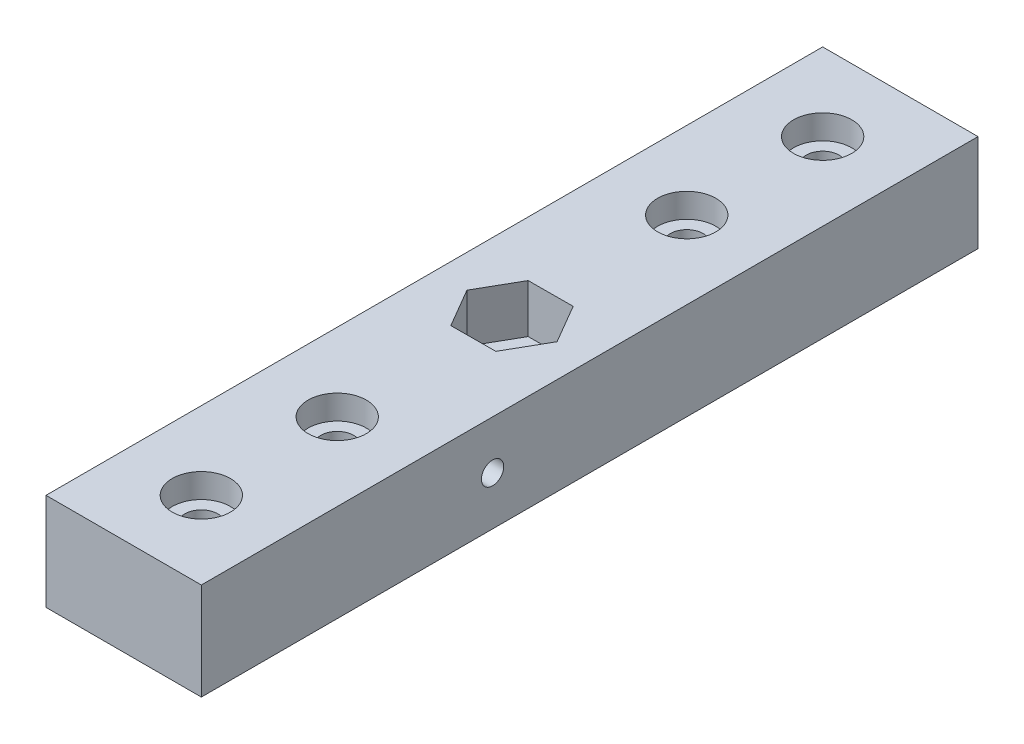
ISO-10303-21;
HEADER;
FILE_DESCRIPTION(('STEP AP214'),'2;1');
FILE_NAME('part.step','',(''),(''),'','','');
FILE_SCHEMA(('AUTOMOTIVE_DESIGN { 1 0 10303 214 1 1 1 1 }'));
ENDSEC;
DATA;
#1=APPLICATION_CONTEXT('core data for automotive mechanical design processes');
#2=APPLICATION_PROTOCOL_DEFINITION('international standard','automotive_design',2000,#1);
#3=PRODUCT_CONTEXT('',#1,'mechanical');
#4=PRODUCT('Part','Part','',(#3));
#5=PRODUCT_RELATED_PRODUCT_CATEGORY('part','',(#4));
#6=PRODUCT_DEFINITION_FORMATION('','',#4);
#7=PRODUCT_DEFINITION_CONTEXT('part definition',#1,'design');
#8=PRODUCT_DEFINITION('design','',#6,#7);
#9=PRODUCT_DEFINITION_SHAPE('','',#8);
#10=(LENGTH_UNIT() NAMED_UNIT(*) SI_UNIT(.MILLI.,.METRE.));
#11=(NAMED_UNIT(*) PLANE_ANGLE_UNIT() SI_UNIT($,.RADIAN.));
#12=(NAMED_UNIT(*) SI_UNIT($,.STERADIAN.) SOLID_ANGLE_UNIT());
#13=UNCERTAINTY_MEASURE_WITH_UNIT(LENGTH_MEASURE(1.E-05),#10,'distance_accuracy_value','');
#14=(GEOMETRIC_REPRESENTATION_CONTEXT(3) GLOBAL_UNCERTAINTY_ASSIGNED_CONTEXT((#13)) GLOBAL_UNIT_ASSIGNED_CONTEXT((#10,
#11,#12)) REPRESENTATION_CONTEXT('',''));
#15=CARTESIAN_POINT('',(0.,0.,0.));
#16=DIRECTION('',(0.,0.,1.));
#17=DIRECTION('',(1.,0.,0.));
#18=AXIS2_PLACEMENT_3D('',#15,#16,#17);
#19=CARTESIAN_POINT('',(0.,10.,0.));
#20=DIRECTION('',(0.,1.,0.));
#21=DIRECTION('',(0.,0.,1.));
#22=AXIS2_PLACEMENT_3D('',#19,#20,#21);
#23=PLANE('',#22);
#24=CARTESIAN_POINT('',(0.,10.,-58.));
#25=DIRECTION('',(0.,1.,0.));
#26=DIRECTION('',(0.,0.,1.));
#27=AXIS2_PLACEMENT_3D('',#24,#25,#26);
#28=CIRCLE('',#27,3.);
#29=CARTESIAN_POINT('',(0.,10.,-55.));
#30=VERTEX_POINT('',#29);
#31=EDGE_CURVE('E159',#30,#30,#28,.T.);
#32=ORIENTED_EDGE('',*,*,#31,.F.);
#33=EDGE_LOOP('',(#32));
#34=FACE_BOUND('',#33,.T.);
#35=CARTESIAN_POINT('',(0.,10.,-22.));
#36=DIRECTION('',(0.,1.,0.));
#37=DIRECTION('',(0.,0.,1.));
#38=AXIS2_PLACEMENT_3D('',#35,#36,#37);
#39=CIRCLE('',#38,3.);
#40=CARTESIAN_POINT('',(0.,10.,-19.));
#41=VERTEX_POINT('',#40);
#42=EDGE_CURVE('E165',#41,#41,#39,.T.);
#43=ORIENTED_EDGE('',*,*,#42,.F.);
#44=EDGE_LOOP('',(#43));
#45=FACE_BOUND('',#44,.T.);
#46=CARTESIAN_POINT('',(0.,10.,-8.));
#47=DIRECTION('',(0.,1.,0.));
#48=DIRECTION('',(0.,0.,1.));
#49=AXIS2_PLACEMENT_3D('',#46,#47,#48);
#50=CIRCLE('',#49,3.);
#51=CARTESIAN_POINT('',(0.,10.,-5.));
#52=VERTEX_POINT('',#51);
#53=EDGE_CURVE('E153',#52,#52,#50,.T.);
#54=ORIENTED_EDGE('',*,*,#53,.F.);
#55=EDGE_LOOP('',(#54));
#56=FACE_BOUND('',#55,.T.);
#57=CARTESIAN_POINT('',(0.,10.,-72.));
#58=DIRECTION('',(0.,1.,0.));
#59=DIRECTION('',(0.,0.,1.));
#60=AXIS2_PLACEMENT_3D('',#57,#58,#59);
#61=CIRCLE('',#60,3.);
#62=CARTESIAN_POINT('',(0.,10.,-69.));
#63=VERTEX_POINT('',#62);
#64=EDGE_CURVE('E173',#63,#63,#61,.T.);
#65=ORIENTED_EDGE('',*,*,#64,.F.);
#66=EDGE_LOOP('',(#65));
#67=FACE_BOUND('',#66,.T.);
#68=DIRECTION('',(0.,0.,1.));
#69=VECTOR('',#68,1.);
#70=CARTESIAN_POINT('',(-8.00000000000001,10.,-80.));
#71=LINE('',#70,#69);
#72=CARTESIAN_POINT('',(-8.00000000000001,10.,-80.));
#73=VERTEX_POINT('',#72);
#74=CARTESIAN_POINT('',(-8.,10.,0.));
#75=VERTEX_POINT('',#74);
#76=EDGE_CURVE('E207',#73,#75,#71,.T.);
#77=ORIENTED_EDGE('',*,*,#76,.T.);
#78=DIRECTION('',(1.,0.,0.));
#79=VECTOR('',#78,1.);
#80=CARTESIAN_POINT('',(-8.,10.,0.));
#81=LINE('',#80,#79);
#82=CARTESIAN_POINT('',(8.,10.,0.));
#83=VERTEX_POINT('',#82);
#84=EDGE_CURVE('E87',#75,#83,#81,.T.);
#85=ORIENTED_EDGE('',*,*,#84,.T.);
#86=DIRECTION('',(0.,0.,-1.));
#87=VECTOR('',#86,1.);
#88=CARTESIAN_POINT('',(7.99999999999999,10.,-80.));
#89=LINE('',#88,#87);
#90=CARTESIAN_POINT('',(7.99999999999999,10.,-80.));
#91=VERTEX_POINT('',#90);
#92=EDGE_CURVE('E210',#83,#91,#89,.T.);
#93=ORIENTED_EDGE('',*,*,#92,.T.);
#94=DIRECTION('',(-1.,0.,0.));
#95=VECTOR('',#94,1.);
#96=CARTESIAN_POINT('',(-8.00000000000001,10.,-80.));
#97=LINE('',#96,#95);
#98=EDGE_CURVE('E59',#91,#73,#97,.T.);
#99=ORIENTED_EDGE('',*,*,#98,.T.);
#100=EDGE_LOOP('',(#77,#85,#93,#99));
#101=FACE_BOUND('',#100,.T.);
#102=DIRECTION('',(0.496138938356846,0.,-0.868243142124452));
#103=VECTOR('',#102,1.);
#104=CARTESIAN_POINT('',(-4.61875636696095,10.,-39.979434106117));
#105=LINE('',#104,#103);
#106=CARTESIAN_POINT('',(-4.61875636696095,10.,-39.979434106117));
#107=VERTEX_POINT('',#106);
#108=CARTESIAN_POINT('',(-2.3271887700347,10.,-43.9896774007378));
#109=VERTEX_POINT('',#108);
#110=EDGE_CURVE('E137',#107,#109,#105,.T.);
#111=ORIENTED_EDGE('',*,*,#110,.T.);
#112=DIRECTION('',(0.999990086919821,0.,-0.00445264663855527));
#113=VECTOR('',#112,1.);
#114=CARTESIAN_POINT('',(-2.3271887700347,10.,-43.9896774007378));
#115=LINE('',#114,#113);
#116=CARTESIAN_POINT('',(2.29156759692625,10.,-44.0102432946208));
#117=VERTEX_POINT('',#116);
#118=EDGE_CURVE('E50',#109,#117,#115,.T.);
#119=ORIENTED_EDGE('',*,*,#118,.T.);
#120=DIRECTION('',(0.503851148562974,0.,0.863790495485897));
#121=VECTOR('',#120,1.);
#122=CARTESIAN_POINT('',(2.29156759692625,10.,-44.0102432946208));
#123=LINE('',#122,#121);
#124=CARTESIAN_POINT('',(4.61875636696093,10.,-40.020565893883));
#125=VERTEX_POINT('',#124);
#126=EDGE_CURVE('E141',#117,#125,#123,.T.);
#127=ORIENTED_EDGE('',*,*,#126,.T.);
#128=DIRECTION('',(-0.496138938356847,0.,0.868243142124452));
#129=VECTOR('',#128,1.);
#130=CARTESIAN_POINT('',(4.61875636696093,10.,-40.020565893883));
#131=LINE('',#130,#129);
#132=CARTESIAN_POINT('',(2.32718877003467,10.,-36.0103225992622));
#133=VERTEX_POINT('',#132);
#134=EDGE_CURVE('E333',#125,#133,#131,.T.);
#135=ORIENTED_EDGE('',*,*,#134,.T.);
#136=DIRECTION('',(-0.999990086919821,0.,0.00445264663855529));
#137=VECTOR('',#136,1.);
#138=CARTESIAN_POINT('',(2.32718877003467,10.,-36.0103225992622));
#139=LINE('',#138,#137);
#140=CARTESIAN_POINT('',(-2.29156759692626,10.,-35.9897567053792));
#141=VERTEX_POINT('',#140);
#142=EDGE_CURVE('E318',#133,#141,#139,.T.);
#143=ORIENTED_EDGE('',*,*,#142,.T.);
#144=DIRECTION('',(-0.503851148562975,0.,-0.863790495485897));
#145=VECTOR('',#144,1.);
#146=CARTESIAN_POINT('',(-2.29156759692626,10.,-35.9897567053792));
#147=LINE('',#146,#145);
#148=EDGE_CURVE('E314',#141,#107,#147,.T.);
#149=ORIENTED_EDGE('',*,*,#148,.T.);
#150=EDGE_LOOP('',(#111,#119,#127,#135,#143,#149));
#151=FACE_BOUND('',#150,.T.);
#152=ADVANCED_FACE('F33',(#34,#45,#56,#67,#101,#151),#23,.T.);
#153=CARTESIAN_POINT('',(0.,10.,-58.));
#154=DIRECTION('',(0.,-1.,0.));
#155=DIRECTION('',(0.,0.,-1.));
#156=AXIS2_PLACEMENT_3D('',#153,#154,#155);
#157=CYLINDRICAL_SURFACE('',#156,1.7);
#158=CARTESIAN_POINT('',(0.,2.5,-58.));
#159=DIRECTION('',(0.,1.,0.));
#160=DIRECTION('',(0.,0.,1.));
#161=AXIS2_PLACEMENT_3D('',#158,#159,#160);
#162=CIRCLE('',#161,1.7);
#163=CARTESIAN_POINT('',(0.,2.5,-56.3));
#164=VERTEX_POINT('',#163);
#165=EDGE_CURVE('E229',#164,#164,#162,.F.);
#166=ORIENTED_EDGE('',*,*,#165,.T.);
#167=EDGE_LOOP('',(#166));
#168=FACE_BOUND('',#167,.T.);
#169=CARTESIAN_POINT('',(0.,7.5,-58.));
#170=DIRECTION('',(0.,1.,0.));
#171=DIRECTION('',(0.,0.,1.));
#172=AXIS2_PLACEMENT_3D('',#169,#170,#171);
#173=CIRCLE('',#172,1.7);
#174=CARTESIAN_POINT('',(0.,7.5,-56.3));
#175=VERTEX_POINT('',#174);
#176=EDGE_CURVE('E180',#175,#175,#173,.T.);
#177=ORIENTED_EDGE('',*,*,#176,.T.);
#178=EDGE_LOOP('',(#177));
#179=FACE_BOUND('',#178,.T.);
#180=ADVANCED_FACE('F246',(#168,#179),#157,.F.);
#181=CARTESIAN_POINT('',(0.,10.,-22.));
#182=DIRECTION('',(0.,-1.,0.));
#183=DIRECTION('',(0.,0.,-1.));
#184=AXIS2_PLACEMENT_3D('',#181,#182,#183);
#185=CYLINDRICAL_SURFACE('',#184,1.7);
#186=CARTESIAN_POINT('',(0.,2.5,-22.));
#187=DIRECTION('',(0.,1.,0.));
#188=DIRECTION('',(0.,0.,1.));
#189=AXIS2_PLACEMENT_3D('',#186,#187,#188);
#190=CIRCLE('',#189,1.7);
#191=CARTESIAN_POINT('',(0.,2.5,-20.3));
#192=VERTEX_POINT('',#191);
#193=EDGE_CURVE('E232',#192,#192,#190,.F.);
#194=ORIENTED_EDGE('',*,*,#193,.T.);
#195=EDGE_LOOP('',(#194));
#196=FACE_BOUND('',#195,.T.);
#197=CARTESIAN_POINT('',(0.,7.5,-22.));
#198=DIRECTION('',(0.,1.,0.));
#199=DIRECTION('',(0.,0.,1.));
#200=AXIS2_PLACEMENT_3D('',#197,#198,#199);
#201=CIRCLE('',#200,1.7);
#202=CARTESIAN_POINT('',(0.,7.5,-20.3));
#203=VERTEX_POINT('',#202);
#204=EDGE_CURVE('E241',#203,#203,#201,.T.);
#205=ORIENTED_EDGE('',*,*,#204,.T.);
#206=EDGE_LOOP('',(#205));
#207=FACE_BOUND('',#206,.T.);
#208=ADVANCED_FACE('F273',(#196,#207),#185,.F.);
#209=CARTESIAN_POINT('',(0.,10.,-8.));
#210=DIRECTION('',(0.,-1.,0.));
#211=DIRECTION('',(0.,0.,-1.));
#212=AXIS2_PLACEMENT_3D('',#209,#210,#211);
#213=CYLINDRICAL_SURFACE('',#212,1.7);
#214=CARTESIAN_POINT('',(0.,2.5,-8.));
#215=DIRECTION('',(0.,1.,0.));
#216=DIRECTION('',(0.,0.,1.));
#217=AXIS2_PLACEMENT_3D('',#214,#215,#216);
#218=CIRCLE('',#217,1.7);
#219=CARTESIAN_POINT('',(0.,2.5,-6.3));
#220=VERTEX_POINT('',#219);
#221=EDGE_CURVE('E228',#220,#220,#218,.F.);
#222=ORIENTED_EDGE('',*,*,#221,.T.);
#223=EDGE_LOOP('',(#222));
#224=FACE_BOUND('',#223,.T.);
#225=CARTESIAN_POINT('',(0.,7.5,-8.));
#226=DIRECTION('',(0.,1.,0.));
#227=DIRECTION('',(0.,0.,1.));
#228=AXIS2_PLACEMENT_3D('',#225,#226,#227);
#229=CIRCLE('',#228,1.7);
#230=CARTESIAN_POINT('',(0.,7.5,-6.3));
#231=VERTEX_POINT('',#230);
#232=EDGE_CURVE('E158',#231,#231,#229,.T.);
#233=ORIENTED_EDGE('',*,*,#232,.T.);
#234=EDGE_LOOP('',(#233));
#235=FACE_BOUND('',#234,.T.);
#236=ADVANCED_FACE('F571',(#224,#235),#213,.F.);
#237=CARTESIAN_POINT('',(0.,10.,-72.));
#238=DIRECTION('',(0.,-1.,0.));
#239=DIRECTION('',(0.,0.,-1.));
#240=AXIS2_PLACEMENT_3D('',#237,#238,#239);
#241=CYLINDRICAL_SURFACE('',#240,1.70000000000001);
#242=CARTESIAN_POINT('',(0.,2.5,-72.));
#243=DIRECTION('',(0.,1.,0.));
#244=DIRECTION('',(0.,0.,1.));
#245=AXIS2_PLACEMENT_3D('',#242,#243,#244);
#246=CIRCLE('',#245,1.70000000000001);
#247=CARTESIAN_POINT('',(0.,2.5,-70.3));
#248=VERTEX_POINT('',#247);
#249=EDGE_CURVE('E200',#248,#248,#246,.F.);
#250=ORIENTED_EDGE('',*,*,#249,.T.);
#251=EDGE_LOOP('',(#250));
#252=FACE_BOUND('',#251,.T.);
#253=CARTESIAN_POINT('',(0.,7.5,-72.));
#254=DIRECTION('',(0.,1.,0.));
#255=DIRECTION('',(0.,0.,1.));
#256=AXIS2_PLACEMENT_3D('',#253,#254,#255);
#257=CIRCLE('',#256,1.70000000000001);
#258=CARTESIAN_POINT('',(0.,7.5,-70.3));
#259=VERTEX_POINT('',#258);
#260=EDGE_CURVE('E176',#259,#259,#257,.T.);
#261=ORIENTED_EDGE('',*,*,#260,.T.);
#262=EDGE_LOOP('',(#261));
#263=FACE_BOUND('',#262,.T.);
#264=ADVANCED_FACE('F297',(#252,#263),#241,.F.);
#265=CARTESIAN_POINT('',(-8.00000000000001,10.,-80.));
#266=DIRECTION('',(1.,0.,0.));
#267=DIRECTION('',(0.,0.,-1.));
#268=AXIS2_PLACEMENT_3D('',#265,#266,#267);
#269=PLANE('',#268);
#270=CARTESIAN_POINT('',(-8.00000000000001,5.,-30.));
#271=DIRECTION('',(1.,0.,0.));
#272=DIRECTION('',(0.,0.,-1.));
#273=AXIS2_PLACEMENT_3D('',#270,#271,#272);
#274=CIRCLE('',#273,1.15);
#275=CARTESIAN_POINT('',(-8.00000000000001,5.,-31.15));
#276=VERTEX_POINT('',#275);
#277=EDGE_CURVE('E146',#276,#276,#274,.T.);
#278=ORIENTED_EDGE('',*,*,#277,.T.);
#279=EDGE_LOOP('',(#278));
#280=FACE_BOUND('',#279,.T.);
#281=DIRECTION('',(0.,0.,1.));
#282=VECTOR('',#281,1.);
#283=CARTESIAN_POINT('',(-8.00000000000001,0.,-80.));
#284=LINE('',#283,#282);
#285=CARTESIAN_POINT('',(-8.00000000000001,0.,-80.));
#286=VERTEX_POINT('',#285);
#287=CARTESIAN_POINT('',(-8.,0.,0.));
#288=VERTEX_POINT('',#287);
#289=EDGE_CURVE('E204',#286,#288,#284,.T.);
#290=ORIENTED_EDGE('',*,*,#289,.T.);
#291=DIRECTION('',(0.,-1.,0.));
#292=VECTOR('',#291,1.);
#293=CARTESIAN_POINT('',(-8.,10.,0.));
#294=LINE('',#293,#292);
#295=EDGE_CURVE('E11',#75,#288,#294,.T.);
#296=ORIENTED_EDGE('',*,*,#295,.F.);
#297=ORIENTED_EDGE('',*,*,#76,.F.);
#298=DIRECTION('',(0.,-1.,0.));
#299=VECTOR('',#298,1.);
#300=CARTESIAN_POINT('',(-8.00000000000001,10.,-80.));
#301=LINE('',#300,#299);
#302=EDGE_CURVE('E213',#73,#286,#301,.T.);
#303=ORIENTED_EDGE('',*,*,#302,.T.);
#304=EDGE_LOOP('',(#290,#296,#297,#303));
#305=FACE_BOUND('',#304,.T.);
#306=ADVANCED_FACE('F35',(#280,#305),#269,.F.);
#307=CARTESIAN_POINT('',(-8.,10.,0.));
#308=DIRECTION('',(0.,0.,-1.));
#309=DIRECTION('',(-1.,0.,0.));
#310=AXIS2_PLACEMENT_3D('',#307,#308,#309);
#311=PLANE('',#310);
#312=DIRECTION('',(1.,0.,0.));
#313=VECTOR('',#312,1.);
#314=CARTESIAN_POINT('',(-8.,0.,0.));
#315=LINE('',#314,#313);
#316=CARTESIAN_POINT('',(8.,0.,0.));
#317=VERTEX_POINT('',#316);
#318=EDGE_CURVE('E216',#288,#317,#315,.T.);
#319=ORIENTED_EDGE('',*,*,#318,.T.);
#320=DIRECTION('',(0.,-1.,0.));
#321=VECTOR('',#320,1.);
#322=CARTESIAN_POINT('',(8.,10.,0.));
#323=LINE('',#322,#321);
#324=EDGE_CURVE('E42',#83,#317,#323,.T.);
#325=ORIENTED_EDGE('',*,*,#324,.F.);
#326=ORIENTED_EDGE('',*,*,#84,.F.);
#327=ORIENTED_EDGE('',*,*,#295,.T.);
#328=EDGE_LOOP('',(#319,#325,#326,#327));
#329=FACE_BOUND('',#328,.T.);
#330=ADVANCED_FACE('F291',(#329),#311,.F.);
#331=CARTESIAN_POINT('',(7.99999999999999,10.,-80.));
#332=DIRECTION('',(-1.,0.,0.));
#333=DIRECTION('',(0.,0.,1.));
#334=AXIS2_PLACEMENT_3D('',#331,#332,#333);
#335=PLANE('',#334);
#336=CARTESIAN_POINT('',(8.,5.,-30.));
#337=DIRECTION('',(1.,0.,0.));
#338=DIRECTION('',(0.,0.,-1.));
#339=AXIS2_PLACEMENT_3D('',#336,#337,#338);
#340=CIRCLE('',#339,1.15);
#341=CARTESIAN_POINT('',(8.,5.,-31.15));
#342=VERTEX_POINT('',#341);
#343=EDGE_CURVE('E142',#342,#342,#340,.T.);
#344=ORIENTED_EDGE('',*,*,#343,.F.);
#345=EDGE_LOOP('',(#344));
#346=FACE_BOUND('',#345,.T.);
#347=DIRECTION('',(0.,0.,-1.));
#348=VECTOR('',#347,1.);
#349=CARTESIAN_POINT('',(7.99999999999999,0.,-80.));
#350=LINE('',#349,#348);
#351=CARTESIAN_POINT('',(7.99999999999999,0.,-80.));
#352=VERTEX_POINT('',#351);
#353=EDGE_CURVE('E218',#317,#352,#350,.T.);
#354=ORIENTED_EDGE('',*,*,#353,.T.);
#355=DIRECTION('',(0.,-1.,0.));
#356=VECTOR('',#355,1.);
#357=CARTESIAN_POINT('',(7.99999999999999,10.,-80.));
#358=LINE('',#357,#356);
#359=EDGE_CURVE('E222',#91,#352,#358,.T.);
#360=ORIENTED_EDGE('',*,*,#359,.F.);
#361=ORIENTED_EDGE('',*,*,#92,.F.);
#362=ORIENTED_EDGE('',*,*,#324,.T.);
#363=EDGE_LOOP('',(#354,#360,#361,#362));
#364=FACE_BOUND('',#363,.T.);
#365=ADVANCED_FACE('F289',(#346,#364),#335,.F.);
#366=CARTESIAN_POINT('',(-8.00000000000001,10.,-80.));
#367=DIRECTION('',(0.,0.,1.));
#368=DIRECTION('',(1.,0.,0.));
#369=AXIS2_PLACEMENT_3D('',#366,#367,#368);
#370=PLANE('',#369);
#371=DIRECTION('',(-1.,0.,0.));
#372=VECTOR('',#371,1.);
#373=CARTESIAN_POINT('',(-8.00000000000001,0.,-80.));
#374=LINE('',#373,#372);
#375=EDGE_CURVE('E80',#352,#286,#374,.T.);
#376=ORIENTED_EDGE('',*,*,#375,.T.);
#377=ORIENTED_EDGE('',*,*,#302,.F.);
#378=ORIENTED_EDGE('',*,*,#98,.F.);
#379=ORIENTED_EDGE('',*,*,#359,.T.);
#380=EDGE_LOOP('',(#376,#377,#378,#379));
#381=FACE_BOUND('',#380,.T.);
#382=ADVANCED_FACE('F285',(#381),#370,.F.);
#383=CARTESIAN_POINT('',(0.,0.,0.));
#384=DIRECTION('',(0.,1.,0.));
#385=DIRECTION('',(0.,0.,1.));
#386=AXIS2_PLACEMENT_3D('',#383,#384,#385);
#387=PLANE('',#386);
#388=CARTESIAN_POINT('',(0.,0.,-40.));
#389=DIRECTION('',(0.,1.,0.));
#390=DIRECTION('',(0.,0.,1.));
#391=AXIS2_PLACEMENT_3D('',#388,#389,#390);
#392=CIRCLE('',#391,2.5);
#393=CARTESIAN_POINT('',(0.,0.,-37.5));
#394=VERTEX_POINT('',#393);
#395=EDGE_CURVE('E341',#394,#394,#392,.F.);
#396=ORIENTED_EDGE('',*,*,#395,.F.);
#397=EDGE_LOOP('',(#396));
#398=FACE_BOUND('',#397,.T.);
#399=CARTESIAN_POINT('',(0.,0.,-58.));
#400=DIRECTION('',(0.,1.,0.));
#401=DIRECTION('',(0.,0.,1.));
#402=AXIS2_PLACEMENT_3D('',#399,#400,#401);
#403=CIRCLE('',#402,2.35);
#404=CARTESIAN_POINT('',(0.,0.,-55.65));
#405=VERTEX_POINT('',#404);
#406=EDGE_CURVE('E181',#405,#405,#403,.T.);
#407=ORIENTED_EDGE('',*,*,#406,.T.);
#408=EDGE_LOOP('',(#407));
#409=FACE_BOUND('',#408,.T.);
#410=CARTESIAN_POINT('',(0.,0.,-22.));
#411=DIRECTION('',(0.,1.,0.));
#412=DIRECTION('',(0.,0.,1.));
#413=AXIS2_PLACEMENT_3D('',#410,#411,#412);
#414=CIRCLE('',#413,2.35);
#415=CARTESIAN_POINT('',(0.,0.,-19.65));
#416=VERTEX_POINT('',#415);
#417=EDGE_CURVE('E188',#416,#416,#414,.T.);
#418=ORIENTED_EDGE('',*,*,#417,.T.);
#419=EDGE_LOOP('',(#418));
#420=FACE_BOUND('',#419,.T.);
#421=CARTESIAN_POINT('',(0.,0.,-8.));
#422=DIRECTION('',(0.,1.,0.));
#423=DIRECTION('',(0.,0.,1.));
#424=AXIS2_PLACEMENT_3D('',#421,#422,#423);
#425=CIRCLE('',#424,2.35);
#426=CARTESIAN_POINT('',(0.,0.,-5.65));
#427=VERTEX_POINT('',#426);
#428=EDGE_CURVE('E194',#427,#427,#425,.T.);
#429=ORIENTED_EDGE('',*,*,#428,.T.);
#430=EDGE_LOOP('',(#429));
#431=FACE_BOUND('',#430,.T.);
#432=CARTESIAN_POINT('',(0.,0.,-72.));
#433=DIRECTION('',(0.,1.,0.));
#434=DIRECTION('',(0.,0.,1.));
#435=AXIS2_PLACEMENT_3D('',#432,#433,#434);
#436=CIRCLE('',#435,2.35000000000001);
#437=CARTESIAN_POINT('',(0.,0.,-69.65));
#438=VERTEX_POINT('',#437);
#439=EDGE_CURVE('E184',#438,#438,#436,.T.);
#440=ORIENTED_EDGE('',*,*,#439,.T.);
#441=EDGE_LOOP('',(#440));
#442=FACE_BOUND('',#441,.T.);
#443=ORIENTED_EDGE('',*,*,#289,.F.);
#444=ORIENTED_EDGE('',*,*,#375,.F.);
#445=ORIENTED_EDGE('',*,*,#353,.F.);
#446=ORIENTED_EDGE('',*,*,#318,.F.);
#447=EDGE_LOOP('',(#443,#444,#445,#446));
#448=FACE_BOUND('',#447,.T.);
#449=ADVANCED_FACE('F282',(#398,#409,#420,#431,#442,#448),#387,.F.);
#450=CARTESIAN_POINT('',(0.,2.5,-72.));
#451=DIRECTION('',(0.,-1.,0.));
#452=DIRECTION('',(0.,0.,-1.));
#453=AXIS2_PLACEMENT_3D('',#450,#451,#452);
#454=CYLINDRICAL_SURFACE('',#453,2.35000000000001);
#455=CARTESIAN_POINT('',(0.,2.5,-72.));
#456=DIRECTION('',(0.,1.,0.));
#457=DIRECTION('',(0.,0.,1.));
#458=AXIS2_PLACEMENT_3D('',#455,#456,#457);
#459=CIRCLE('',#458,2.35000000000001);
#460=CARTESIAN_POINT('',(0.,2.5,-69.65));
#461=VERTEX_POINT('',#460);
#462=EDGE_CURVE('E201',#461,#461,#459,.T.);
#463=ORIENTED_EDGE('',*,*,#462,.T.);
#464=EDGE_LOOP('',(#463));
#465=FACE_BOUND('',#464,.T.);
#466=ORIENTED_EDGE('',*,*,#439,.F.);
#467=EDGE_LOOP('',(#466));
#468=FACE_BOUND('',#467,.T.);
#469=ADVANCED_FACE('F280',(#465,#468),#454,.F.);
#470=CARTESIAN_POINT('',(0.,2.5,-72.));
#471=DIRECTION('',(0.,1.,0.));
#472=DIRECTION('',(0.,0.,1.));
#473=AXIS2_PLACEMENT_3D('',#470,#471,#472);
#474=PLANE('',#473);
#475=ORIENTED_EDGE('',*,*,#249,.F.);
#476=EDGE_LOOP('',(#475));
#477=FACE_BOUND('',#476,.T.);
#478=ORIENTED_EDGE('',*,*,#462,.F.);
#479=EDGE_LOOP('',(#478));
#480=FACE_BOUND('',#479,.T.);
#481=ADVANCED_FACE('F439',(#477,#480),#474,.F.);
#482=CARTESIAN_POINT('',(0.,2.5,-8.));
#483=DIRECTION('',(0.,-1.,0.));
#484=DIRECTION('',(0.,0.,-1.));
#485=AXIS2_PLACEMENT_3D('',#482,#483,#484);
#486=CYLINDRICAL_SURFACE('',#485,2.35);
#487=CARTESIAN_POINT('',(0.,2.5,-8.));
#488=DIRECTION('',(0.,1.,0.));
#489=DIRECTION('',(0.,0.,1.));
#490=AXIS2_PLACEMENT_3D('',#487,#488,#489);
#491=CIRCLE('',#490,2.35);
#492=CARTESIAN_POINT('',(0.,2.5,-5.65));
#493=VERTEX_POINT('',#492);
#494=EDGE_CURVE('E197',#493,#493,#491,.T.);
#495=ORIENTED_EDGE('',*,*,#494,.T.);
#496=EDGE_LOOP('',(#495));
#497=FACE_BOUND('',#496,.T.);
#498=ORIENTED_EDGE('',*,*,#428,.F.);
#499=EDGE_LOOP('',(#498));
#500=FACE_BOUND('',#499,.T.);
#501=ADVANCED_FACE('F446',(#497,#500),#486,.F.);
#502=CARTESIAN_POINT('',(0.,2.5,-8.));
#503=DIRECTION('',(0.,1.,0.));
#504=DIRECTION('',(0.,0.,1.));
#505=AXIS2_PLACEMENT_3D('',#502,#503,#504);
#506=PLANE('',#505);
#507=ORIENTED_EDGE('',*,*,#221,.F.);
#508=EDGE_LOOP('',(#507));
#509=FACE_BOUND('',#508,.T.);
#510=ORIENTED_EDGE('',*,*,#494,.F.);
#511=EDGE_LOOP('',(#510));
#512=FACE_BOUND('',#511,.T.);
#513=ADVANCED_FACE('F454',(#509,#512),#506,.F.);
#514=CARTESIAN_POINT('',(0.,2.5,-22.));
#515=DIRECTION('',(0.,-1.,0.));
#516=DIRECTION('',(0.,0.,-1.));
#517=AXIS2_PLACEMENT_3D('',#514,#515,#516);
#518=CYLINDRICAL_SURFACE('',#517,2.35);
#519=CARTESIAN_POINT('',(0.,2.5,-22.));
#520=DIRECTION('',(0.,1.,0.));
#521=DIRECTION('',(0.,0.,1.));
#522=AXIS2_PLACEMENT_3D('',#519,#520,#521);
#523=CIRCLE('',#522,2.35);
#524=CARTESIAN_POINT('',(0.,2.5,-19.65));
#525=VERTEX_POINT('',#524);
#526=EDGE_CURVE('E191',#525,#525,#523,.T.);
#527=ORIENTED_EDGE('',*,*,#526,.T.);
#528=EDGE_LOOP('',(#527));
#529=FACE_BOUND('',#528,.T.);
#530=ORIENTED_EDGE('',*,*,#417,.F.);
#531=EDGE_LOOP('',(#530));
#532=FACE_BOUND('',#531,.T.);
#533=ADVANCED_FACE('F462',(#529,#532),#518,.F.);
#534=CARTESIAN_POINT('',(0.,2.5,-22.));
#535=DIRECTION('',(0.,1.,0.));
#536=DIRECTION('',(0.,0.,1.));
#537=AXIS2_PLACEMENT_3D('',#534,#535,#536);
#538=PLANE('',#537);
#539=ORIENTED_EDGE('',*,*,#193,.F.);
#540=EDGE_LOOP('',(#539));
#541=FACE_BOUND('',#540,.T.);
#542=ORIENTED_EDGE('',*,*,#526,.F.);
#543=EDGE_LOOP('',(#542));
#544=FACE_BOUND('',#543,.T.);
#545=ADVANCED_FACE('F470',(#541,#544),#538,.F.);
#546=CARTESIAN_POINT('',(0.,2.5,-58.));
#547=DIRECTION('',(0.,-1.,0.));
#548=DIRECTION('',(0.,0.,-1.));
#549=AXIS2_PLACEMENT_3D('',#546,#547,#548);
#550=CYLINDRICAL_SURFACE('',#549,2.35);
#551=CARTESIAN_POINT('',(0.,2.5,-58.));
#552=DIRECTION('',(0.,1.,0.));
#553=DIRECTION('',(0.,0.,1.));
#554=AXIS2_PLACEMENT_3D('',#551,#552,#553);
#555=CIRCLE('',#554,2.35);
#556=CARTESIAN_POINT('',(0.,2.5,-55.65));
#557=VERTEX_POINT('',#556);
#558=EDGE_CURVE('E185',#557,#557,#555,.T.);
#559=ORIENTED_EDGE('',*,*,#558,.T.);
#560=EDGE_LOOP('',(#559));
#561=FACE_BOUND('',#560,.T.);
#562=ORIENTED_EDGE('',*,*,#406,.F.);
#563=EDGE_LOOP('',(#562));
#564=FACE_BOUND('',#563,.T.);
#565=ADVANCED_FACE('F477',(#561,#564),#550,.F.);
#566=CARTESIAN_POINT('',(0.,2.5,-58.));
#567=DIRECTION('',(0.,1.,0.));
#568=DIRECTION('',(0.,0.,1.));
#569=AXIS2_PLACEMENT_3D('',#566,#567,#568);
#570=PLANE('',#569);
#571=ORIENTED_EDGE('',*,*,#165,.F.);
#572=EDGE_LOOP('',(#571));
#573=FACE_BOUND('',#572,.T.);
#574=ORIENTED_EDGE('',*,*,#558,.F.);
#575=EDGE_LOOP('',(#574));
#576=FACE_BOUND('',#575,.T.);
#577=ADVANCED_FACE('F485',(#573,#576),#570,.F.);
#578=CARTESIAN_POINT('',(0.,10.,-72.));
#579=DIRECTION('',(0.,-1.,0.));
#580=DIRECTION('',(0.,0.,-1.));
#581=AXIS2_PLACEMENT_3D('',#578,#579,#580);
#582=CYLINDRICAL_SURFACE('',#581,3.);
#583=ORIENTED_EDGE('',*,*,#64,.T.);
#584=EDGE_LOOP('',(#583));
#585=FACE_BOUND('',#584,.T.);
#586=CARTESIAN_POINT('',(0.,7.5,-72.));
#587=DIRECTION('',(0.,1.,0.));
#588=DIRECTION('',(0.,0.,1.));
#589=AXIS2_PLACEMENT_3D('',#586,#587,#588);
#590=CIRCLE('',#589,3.);
#591=CARTESIAN_POINT('',(0.,7.5,-69.));
#592=VERTEX_POINT('',#591);
#593=EDGE_CURVE('E177',#592,#592,#590,.T.);
#594=ORIENTED_EDGE('',*,*,#593,.F.);
#595=EDGE_LOOP('',(#594));
#596=FACE_BOUND('',#595,.T.);
#597=ADVANCED_FACE('F492',(#585,#596),#582,.F.);
#598=CARTESIAN_POINT('',(0.,7.5,-72.));
#599=DIRECTION('',(0.,1.,0.));
#600=DIRECTION('',(0.,0.,1.));
#601=AXIS2_PLACEMENT_3D('',#598,#599,#600);
#602=PLANE('',#601);
#603=ORIENTED_EDGE('',*,*,#260,.F.);
#604=EDGE_LOOP('',(#603));
#605=FACE_BOUND('',#604,.T.);
#606=ORIENTED_EDGE('',*,*,#593,.T.);
#607=EDGE_LOOP('',(#606));
#608=FACE_BOUND('',#607,.T.);
#609=ADVANCED_FACE('F501',(#605,#608),#602,.T.);
#610=CARTESIAN_POINT('',(0.,10.,-8.));
#611=DIRECTION('',(0.,-1.,0.));
#612=DIRECTION('',(0.,0.,-1.));
#613=AXIS2_PLACEMENT_3D('',#610,#611,#612);
#614=CYLINDRICAL_SURFACE('',#613,3.);
#615=ORIENTED_EDGE('',*,*,#53,.T.);
#616=EDGE_LOOP('',(#615));
#617=FACE_BOUND('',#616,.T.);
#618=CARTESIAN_POINT('',(0.,7.5,-8.));
#619=DIRECTION('',(0.,1.,0.));
#620=DIRECTION('',(0.,0.,1.));
#621=AXIS2_PLACEMENT_3D('',#618,#619,#620);
#622=CIRCLE('',#621,3.);
#623=CARTESIAN_POINT('',(0.,7.5,-5.));
#624=VERTEX_POINT('',#623);
#625=EDGE_CURVE('E168',#624,#624,#622,.T.);
#626=ORIENTED_EDGE('',*,*,#625,.F.);
#627=EDGE_LOOP('',(#626));
#628=FACE_BOUND('',#627,.T.);
#629=ADVANCED_FACE('F510',(#617,#628),#614,.F.);
#630=CARTESIAN_POINT('',(0.,7.5,-8.));
#631=DIRECTION('',(0.,1.,0.));
#632=DIRECTION('',(0.,0.,1.));
#633=AXIS2_PLACEMENT_3D('',#630,#631,#632);
#634=PLANE('',#633);
#635=ORIENTED_EDGE('',*,*,#232,.F.);
#636=EDGE_LOOP('',(#635));
#637=FACE_BOUND('',#636,.T.);
#638=ORIENTED_EDGE('',*,*,#625,.T.);
#639=EDGE_LOOP('',(#638));
#640=FACE_BOUND('',#639,.T.);
#641=ADVANCED_FACE('F518',(#637,#640),#634,.T.);
#642=CARTESIAN_POINT('',(0.,10.,-22.));
#643=DIRECTION('',(0.,-1.,0.));
#644=DIRECTION('',(0.,0.,-1.));
#645=AXIS2_PLACEMENT_3D('',#642,#643,#644);
#646=CYLINDRICAL_SURFACE('',#645,3.);
#647=ORIENTED_EDGE('',*,*,#42,.T.);
#648=EDGE_LOOP('',(#647));
#649=FACE_BOUND('',#648,.T.);
#650=CARTESIAN_POINT('',(0.,7.5,-22.));
#651=DIRECTION('',(0.,1.,0.));
#652=DIRECTION('',(0.,0.,1.));
#653=AXIS2_PLACEMENT_3D('',#650,#651,#652);
#654=CIRCLE('',#653,3.);
#655=CARTESIAN_POINT('',(0.,7.5,-19.));
#656=VERTEX_POINT('',#655);
#657=EDGE_CURVE('E162',#656,#656,#654,.T.);
#658=ORIENTED_EDGE('',*,*,#657,.F.);
#659=EDGE_LOOP('',(#658));
#660=FACE_BOUND('',#659,.T.);
#661=ADVANCED_FACE('F263',(#649,#660),#646,.F.);
#662=CARTESIAN_POINT('',(0.,7.5,-22.));
#663=DIRECTION('',(0.,1.,0.));
#664=DIRECTION('',(0.,0.,1.));
#665=AXIS2_PLACEMENT_3D('',#662,#663,#664);
#666=PLANE('',#665);
#667=ORIENTED_EDGE('',*,*,#204,.F.);
#668=EDGE_LOOP('',(#667));
#669=FACE_BOUND('',#668,.T.);
#670=ORIENTED_EDGE('',*,*,#657,.T.);
#671=EDGE_LOOP('',(#670));
#672=FACE_BOUND('',#671,.T.);
#673=ADVANCED_FACE('F257',(#669,#672),#666,.T.);
#674=CARTESIAN_POINT('',(0.,10.,-58.));
#675=DIRECTION('',(0.,-1.,0.));
#676=DIRECTION('',(0.,0.,-1.));
#677=AXIS2_PLACEMENT_3D('',#674,#675,#676);
#678=CYLINDRICAL_SURFACE('',#677,3.);
#679=ORIENTED_EDGE('',*,*,#31,.T.);
#680=EDGE_LOOP('',(#679));
#681=FACE_BOUND('',#680,.T.);
#682=CARTESIAN_POINT('',(0.,7.5,-58.));
#683=DIRECTION('',(0.,1.,0.));
#684=DIRECTION('',(0.,0.,1.));
#685=AXIS2_PLACEMENT_3D('',#682,#683,#684);
#686=CIRCLE('',#685,3.);
#687=CARTESIAN_POINT('',(0.,7.5,-55.));
#688=VERTEX_POINT('',#687);
#689=EDGE_CURVE('E155',#688,#688,#686,.T.);
#690=ORIENTED_EDGE('',*,*,#689,.F.);
#691=EDGE_LOOP('',(#690));
#692=FACE_BOUND('',#691,.T.);
#693=ADVANCED_FACE('F252',(#681,#692),#678,.F.);
#694=CARTESIAN_POINT('',(0.,7.5,-58.));
#695=DIRECTION('',(0.,1.,0.));
#696=DIRECTION('',(0.,0.,1.));
#697=AXIS2_PLACEMENT_3D('',#694,#695,#696);
#698=PLANE('',#697);
#699=ORIENTED_EDGE('',*,*,#176,.F.);
#700=EDGE_LOOP('',(#699));
#701=FACE_BOUND('',#700,.T.);
#702=ORIENTED_EDGE('',*,*,#689,.T.);
#703=EDGE_LOOP('',(#702));
#704=FACE_BOUND('',#703,.T.);
#705=ADVANCED_FACE('F248',(#701,#704),#698,.T.);
#706=CARTESIAN_POINT('',(-8.00000000000001,5.,-30.));
#707=DIRECTION('',(1.,0.,0.));
#708=DIRECTION('',(0.,0.,-1.));
#709=AXIS2_PLACEMENT_3D('',#706,#707,#708);
#710=CYLINDRICAL_SURFACE('',#709,1.15);
#711=ORIENTED_EDGE('',*,*,#277,.F.);
#712=EDGE_LOOP('',(#711));
#713=FACE_BOUND('',#712,.T.);
#714=ORIENTED_EDGE('',*,*,#343,.T.);
#715=EDGE_LOOP('',(#714));
#716=FACE_BOUND('',#715,.T.);
#717=ADVANCED_FACE('F251',(#713,#716),#710,.F.);
#718=CARTESIAN_POINT('',(-2.3271887700347,5.,-43.9896774007378));
#719=DIRECTION('',(0.00445264663855527,0.,0.999990086919821));
#720=DIRECTION('',(0.999990086919822,0.,-0.00445264663855528));
#721=AXIS2_PLACEMENT_3D('',#718,#719,#720);
#722=PLANE('',#721);
#723=ORIENTED_EDGE('',*,*,#118,.F.);
#724=DIRECTION('',(0.,1.,0.));
#725=VECTOR('',#724,1.);
#726=CARTESIAN_POINT('',(-2.3271887700347,5.,-43.9896774007378));
#727=LINE('',#726,#725);
#728=CARTESIAN_POINT('',(-2.3271887700347,5.,-43.9896774007378));
#729=VERTEX_POINT('',#728);
#730=EDGE_CURVE('E136',#729,#109,#727,.T.);
#731=ORIENTED_EDGE('',*,*,#730,.F.);
#732=DIRECTION('',(0.999990086919821,0.,-0.00445264663855527));
#733=VECTOR('',#732,1.);
#734=CARTESIAN_POINT('',(-2.3271887700347,5.,-43.9896774007378));
#735=LINE('',#734,#733);
#736=CARTESIAN_POINT('',(2.29156759692625,5.,-44.0102432946208));
#737=VERTEX_POINT('',#736);
#738=EDGE_CURVE('E127',#729,#737,#735,.T.);
#739=ORIENTED_EDGE('',*,*,#738,.T.);
#740=DIRECTION('',(0.,1.,0.));
#741=VECTOR('',#740,1.);
#742=CARTESIAN_POINT('',(2.29156759692625,5.,-44.0102432946208));
#743=LINE('',#742,#741);
#744=EDGE_CURVE('E135',#737,#117,#743,.T.);
#745=ORIENTED_EDGE('',*,*,#744,.T.);
#746=EDGE_LOOP('',(#723,#731,#739,#745));
#747=FACE_BOUND('',#746,.T.);
#748=ADVANCED_FACE('F134',(#747),#722,.T.);
#749=CARTESIAN_POINT('',(2.29156759692625,5.,-44.0102432946208));
#750=DIRECTION('',(-0.863790495485897,0.,0.503851148562974));
#751=DIRECTION('',(0.503851148562974,0.,0.863790495485897));
#752=AXIS2_PLACEMENT_3D('',#749,#750,#751);
#753=PLANE('',#752);
#754=ORIENTED_EDGE('',*,*,#126,.F.);
#755=ORIENTED_EDGE('',*,*,#744,.F.);
#756=DIRECTION('',(0.503851148562974,0.,0.863790495485897));
#757=VECTOR('',#756,1.);
#758=CARTESIAN_POINT('',(2.29156759692625,5.,-44.0102432946208));
#759=LINE('',#758,#757);
#760=CARTESIAN_POINT('',(4.61875636696093,5.,-40.020565893883));
#761=VERTEX_POINT('',#760);
#762=EDGE_CURVE('E123',#737,#761,#759,.T.);
#763=ORIENTED_EDGE('',*,*,#762,.T.);
#764=DIRECTION('',(0.,1.,0.));
#765=VECTOR('',#764,1.);
#766=CARTESIAN_POINT('',(4.61875636696093,5.,-40.020565893883));
#767=LINE('',#766,#765);
#768=EDGE_CURVE('E143',#761,#125,#767,.T.);
#769=ORIENTED_EDGE('',*,*,#768,.T.);
#770=EDGE_LOOP('',(#754,#755,#763,#769));
#771=FACE_BOUND('',#770,.T.);
#772=ADVANCED_FACE('F139',(#771),#753,.T.);
#773=CARTESIAN_POINT('',(4.61875636696093,5.,-40.020565893883));
#774=DIRECTION('',(-0.868243142124452,0.,-0.496138938356847));
#775=DIRECTION('',(-0.496138938356847,0.,0.868243142124452));
#776=AXIS2_PLACEMENT_3D('',#773,#774,#775);
#777=PLANE('',#776);
#778=ORIENTED_EDGE('',*,*,#134,.F.);
#779=ORIENTED_EDGE('',*,*,#768,.F.);
#780=DIRECTION('',(-0.496138938356847,0.,0.868243142124452));
#781=VECTOR('',#780,1.);
#782=CARTESIAN_POINT('',(4.61875636696093,5.,-40.020565893883));
#783=LINE('',#782,#781);
#784=CARTESIAN_POINT('',(2.32718877003467,5.,-36.0103225992622));
#785=VERTEX_POINT('',#784);
#786=EDGE_CURVE('E129',#761,#785,#783,.T.);
#787=ORIENTED_EDGE('',*,*,#786,.T.);
#788=DIRECTION('',(0.,1.,0.));
#789=VECTOR('',#788,1.);
#790=CARTESIAN_POINT('',(2.32718877003467,5.,-36.0103225992622));
#791=LINE('',#790,#789);
#792=EDGE_CURVE('E148',#785,#133,#791,.T.);
#793=ORIENTED_EDGE('',*,*,#792,.T.);
#794=EDGE_LOOP('',(#778,#779,#787,#793));
#795=FACE_BOUND('',#794,.T.);
#796=ADVANCED_FACE('F331',(#795),#777,.T.);
#797=CARTESIAN_POINT('',(2.32718877003467,5.,-36.0103225992622));
#798=DIRECTION('',(-0.00445264663855529,0.,-0.999990086919822));
#799=DIRECTION('',(-0.999990086919822,0.,0.00445264663855529));
#800=AXIS2_PLACEMENT_3D('',#797,#798,#799);
#801=PLANE('',#800);
#802=ORIENTED_EDGE('',*,*,#142,.F.);
#803=ORIENTED_EDGE('',*,*,#792,.F.);
#804=DIRECTION('',(-0.999990086919821,0.,0.00445264663855529));
#805=VECTOR('',#804,1.);
#806=CARTESIAN_POINT('',(2.32718877003467,5.,-36.0103225992622));
#807=LINE('',#806,#805);
#808=CARTESIAN_POINT('',(-2.29156759692626,5.,-35.9897567053792));
#809=VERTEX_POINT('',#808);
#810=EDGE_CURVE('E345',#785,#809,#807,.T.);
#811=ORIENTED_EDGE('',*,*,#810,.T.);
#812=DIRECTION('',(0.,1.,0.));
#813=VECTOR('',#812,1.);
#814=CARTESIAN_POINT('',(-2.29156759692626,5.,-35.9897567053792));
#815=LINE('',#814,#813);
#816=EDGE_CURVE('E326',#809,#141,#815,.T.);
#817=ORIENTED_EDGE('',*,*,#816,.T.);
#818=EDGE_LOOP('',(#802,#803,#811,#817));
#819=FACE_BOUND('',#818,.T.);
#820=ADVANCED_FACE('F335',(#819),#801,.T.);
#821=CARTESIAN_POINT('',(-2.29156759692626,5.,-35.9897567053792));
#822=DIRECTION('',(0.863790495485897,0.,-0.503851148562975));
#823=DIRECTION('',(-0.503851148562975,0.,-0.863790495485897));
#824=AXIS2_PLACEMENT_3D('',#821,#822,#823);
#825=PLANE('',#824);
#826=ORIENTED_EDGE('',*,*,#148,.F.);
#827=ORIENTED_EDGE('',*,*,#816,.F.);
#828=DIRECTION('',(-0.503851148562975,0.,-0.863790495485897));
#829=VECTOR('',#828,1.);
#830=CARTESIAN_POINT('',(-2.29156759692626,5.,-35.9897567053792));
#831=LINE('',#830,#829);
#832=CARTESIAN_POINT('',(-4.61875636696095,5.,-39.979434106117));
#833=VERTEX_POINT('',#832);
#834=EDGE_CURVE('E343',#809,#833,#831,.T.);
#835=ORIENTED_EDGE('',*,*,#834,.T.);
#836=DIRECTION('',(0.,1.,0.));
#837=VECTOR('',#836,1.);
#838=CARTESIAN_POINT('',(-4.61875636696095,5.,-39.979434106117));
#839=LINE('',#838,#837);
#840=EDGE_CURVE('E323',#833,#107,#839,.T.);
#841=ORIENTED_EDGE('',*,*,#840,.T.);
#842=EDGE_LOOP('',(#826,#827,#835,#841));
#843=FACE_BOUND('',#842,.T.);
#844=ADVANCED_FACE('F364',(#843),#825,.T.);
#845=CARTESIAN_POINT('',(-4.61875636696095,5.,-39.979434106117));
#846=DIRECTION('',(0.868243142124452,0.,0.496138938356846));
#847=DIRECTION('',(0.496138938356846,0.,-0.868243142124452));
#848=AXIS2_PLACEMENT_3D('',#845,#846,#847);
#849=PLANE('',#848);
#850=ORIENTED_EDGE('',*,*,#110,.F.);
#851=ORIENTED_EDGE('',*,*,#840,.F.);
#852=DIRECTION('',(0.496138938356846,0.,-0.868243142124452));
#853=VECTOR('',#852,1.);
#854=CARTESIAN_POINT('',(-4.61875636696095,5.,-39.979434106117));
#855=LINE('',#854,#853);
#856=EDGE_CURVE('E324',#833,#729,#855,.T.);
#857=ORIENTED_EDGE('',*,*,#856,.T.);
#858=ORIENTED_EDGE('',*,*,#730,.T.);
#859=EDGE_LOOP('',(#850,#851,#857,#858));
#860=FACE_BOUND('',#859,.T.);
#861=ADVANCED_FACE('F357',(#860),#849,.T.);
#862=CARTESIAN_POINT('',(0.,5.,0.));
#863=DIRECTION('',(0.,-1.,0.));
#864=DIRECTION('',(0.,0.,-1.));
#865=AXIS2_PLACEMENT_3D('',#862,#863,#864);
#866=PLANE('',#865);
#867=CARTESIAN_POINT('',(0.,5.,-40.));
#868=DIRECTION('',(0.,-1.,0.));
#869=DIRECTION('',(0.,0.,-1.));
#870=AXIS2_PLACEMENT_3D('',#867,#868,#869);
#871=CIRCLE('',#870,2.5);
#872=CARTESIAN_POINT('',(0.,5.,-42.5));
#873=VERTEX_POINT('',#872);
#874=EDGE_CURVE('E37',#873,#873,#871,.F.);
#875=ORIENTED_EDGE('',*,*,#874,.F.);
#876=EDGE_LOOP('',(#875));
#877=FACE_BOUND('',#876,.T.);
#878=ORIENTED_EDGE('',*,*,#738,.F.);
#879=ORIENTED_EDGE('',*,*,#856,.F.);
#880=ORIENTED_EDGE('',*,*,#834,.F.);
#881=ORIENTED_EDGE('',*,*,#810,.F.);
#882=ORIENTED_EDGE('',*,*,#786,.F.);
#883=ORIENTED_EDGE('',*,*,#762,.F.);
#884=EDGE_LOOP('',(#878,#879,#880,#881,#882,#883));
#885=FACE_BOUND('',#884,.T.);
#886=ADVANCED_FACE('F125',(#877,#885),#866,.F.);
#887=CARTESIAN_POINT('',(0.,-15.,-40.));
#888=DIRECTION('',(0.,1.,0.));
#889=DIRECTION('',(0.,0.,1.));
#890=AXIS2_PLACEMENT_3D('',#887,#888,#889);
#891=CYLINDRICAL_SURFACE('',#890,2.5);
#892=ORIENTED_EDGE('',*,*,#874,.T.);
#893=EDGE_LOOP('',(#892));
#894=FACE_BOUND('',#893,.T.);
#895=ORIENTED_EDGE('',*,*,#395,.T.);
#896=EDGE_LOOP('',(#895));
#897=FACE_BOUND('',#896,.T.);
#898=ADVANCED_FACE('F354',(#894,#897),#891,.F.);
#899=CLOSED_SHELL('',(#152,#180,#208,#236,#264,#306,#330,#365,#382,#449,#469,#481,#501,#513,
#533,#545,#565,#577,#597,#609,#629,#641,#661,#673,#693,#705,#717,#748,#772,#796,#820,#844,#861,
#886,#898));
#900=MANIFOLD_SOLID_BREP('B2',#899);
#901=ADVANCED_BREP_SHAPE_REPRESENTATION('',(#18,#900),#14);
#902=SHAPE_DEFINITION_REPRESENTATION(#9,#901);
ENDSEC;
END-ISO-10303-21;
